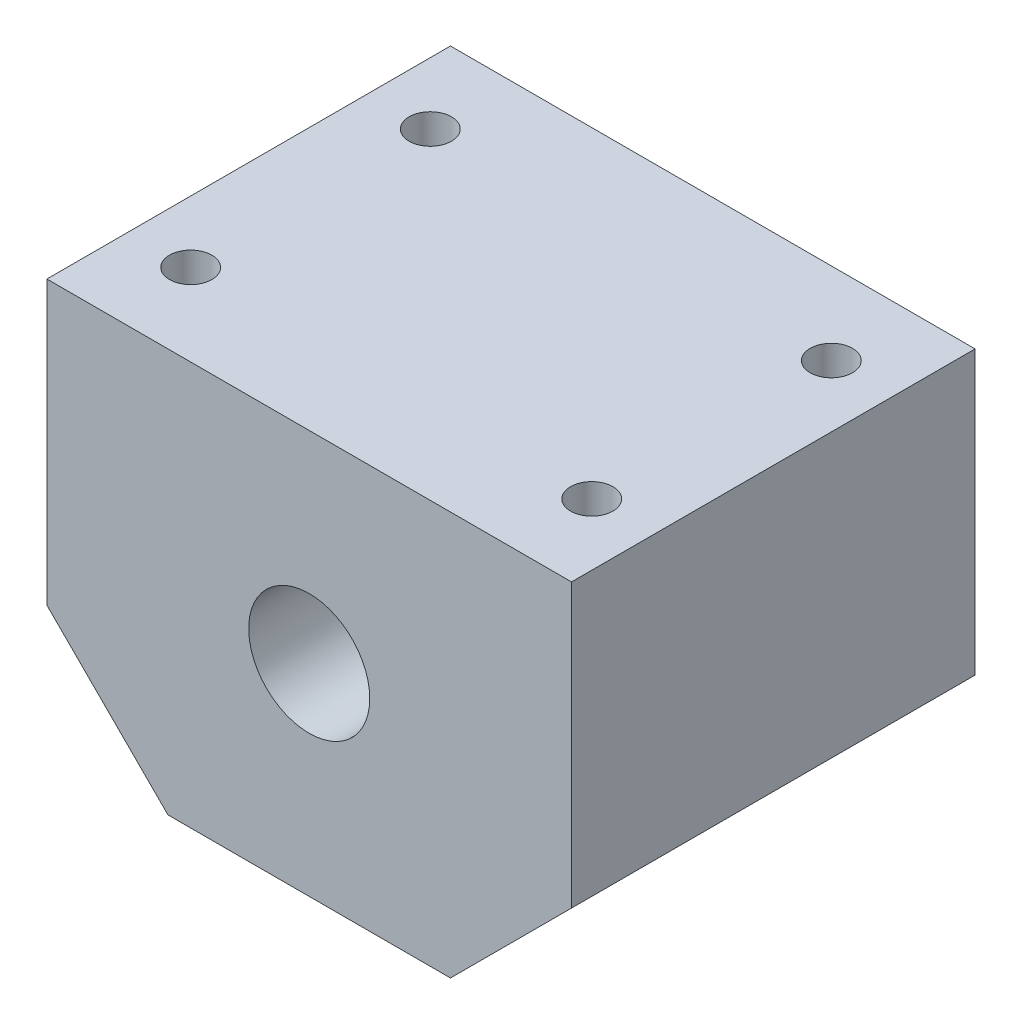
ISO-10303-21;
HEADER;
FILE_DESCRIPTION(('STEP AP214'),'2;1');
FILE_NAME('part.step','',(''),(''),'','','');
FILE_SCHEMA(('AUTOMOTIVE_DESIGN { 1 0 10303 214 1 1 1 1 }'));
ENDSEC;
DATA;
#1=APPLICATION_CONTEXT('core data for automotive mechanical design processes');
#2=APPLICATION_PROTOCOL_DEFINITION('international standard','automotive_design',2000,#1);
#3=PRODUCT_CONTEXT('',#1,'mechanical');
#4=PRODUCT('Part','Part','',(#3));
#5=PRODUCT_RELATED_PRODUCT_CATEGORY('part','',(#4));
#6=PRODUCT_DEFINITION_FORMATION('','',#4);
#7=PRODUCT_DEFINITION_CONTEXT('part definition',#1,'design');
#8=PRODUCT_DEFINITION('design','',#6,#7);
#9=PRODUCT_DEFINITION_SHAPE('','',#8);
#10=(LENGTH_UNIT() NAMED_UNIT(*) SI_UNIT(.MILLI.,.METRE.));
#11=(NAMED_UNIT(*) PLANE_ANGLE_UNIT() SI_UNIT($,.RADIAN.));
#12=(NAMED_UNIT(*) SI_UNIT($,.STERADIAN.) SOLID_ANGLE_UNIT());
#13=UNCERTAINTY_MEASURE_WITH_UNIT(LENGTH_MEASURE(1.E-05),#10,'distance_accuracy_value','');
#14=(GEOMETRIC_REPRESENTATION_CONTEXT(3) GLOBAL_UNCERTAINTY_ASSIGNED_CONTEXT((#13)) GLOBAL_UNIT_ASSIGNED_CONTEXT((#10,
#11,#12)) REPRESENTATION_CONTEXT('',''));
#15=CARTESIAN_POINT('',(0.,0.,0.));
#16=DIRECTION('',(0.,0.,1.));
#17=DIRECTION('',(1.,0.,0.));
#18=AXIS2_PLACEMENT_3D('',#15,#16,#17);
#19=CARTESIAN_POINT('',(0.,0.,20.));
#20=DIRECTION('',(0.,0.,-1.));
#21=DIRECTION('',(-1.,0.,0.));
#22=AXIS2_PLACEMENT_3D('',#19,#20,#21);
#23=PLANE('',#22);
#24=DIRECTION('',(-1.,0.,0.));
#25=VECTOR('',#24,1.);
#26=CARTESIAN_POINT('',(-26.,20.,20.));
#27=LINE('',#26,#25);
#28=CARTESIAN_POINT('',(26.,20.,20.));
#29=VERTEX_POINT('',#28);
#30=CARTESIAN_POINT('',(-26.,20.,20.));
#31=VERTEX_POINT('',#30);
#32=EDGE_CURVE('E135',#29,#31,#27,.T.);
#33=ORIENTED_EDGE('',*,*,#32,.T.);
#34=DIRECTION('',(0.,-1.,0.));
#35=VECTOR('',#34,1.);
#36=CARTESIAN_POINT('',(-26.,20.,20.));
#37=LINE('',#36,#35);
#38=CARTESIAN_POINT('',(-26.,-7.99999999999997,20.));
#39=VERTEX_POINT('',#38);
#40=EDGE_CURVE('E93',#31,#39,#37,.T.);
#41=ORIENTED_EDGE('',*,*,#40,.T.);
#42=DIRECTION('',(0.707106781186547,-0.707106781186548,0.));
#43=VECTOR('',#42,1.);
#44=CARTESIAN_POINT('',(-26.,-7.99999999999997,20.));
#45=LINE('',#44,#43);
#46=CARTESIAN_POINT('',(-14.,-20.,20.));
#47=VERTEX_POINT('',#46);
#48=EDGE_CURVE('E106',#39,#47,#45,.T.);
#49=ORIENTED_EDGE('',*,*,#48,.T.);
#50=DIRECTION('',(1.,0.,0.));
#51=VECTOR('',#50,1.);
#52=CARTESIAN_POINT('',(-14.,-20.,20.));
#53=LINE('',#52,#51);
#54=CARTESIAN_POINT('',(14.,-20.,20.));
#55=VERTEX_POINT('',#54);
#56=EDGE_CURVE('E100',#47,#55,#53,.T.);
#57=ORIENTED_EDGE('',*,*,#56,.T.);
#58=DIRECTION('',(0.707106781186547,0.707106781186548,0.));
#59=VECTOR('',#58,1.);
#60=CARTESIAN_POINT('',(26.,-7.99999999999997,20.));
#61=LINE('',#60,#59);
#62=CARTESIAN_POINT('',(26.,-7.99999999999997,20.));
#63=VERTEX_POINT('',#62);
#64=EDGE_CURVE('E104',#55,#63,#61,.T.);
#65=ORIENTED_EDGE('',*,*,#64,.T.);
#66=DIRECTION('',(0.,1.,0.));
#67=VECTOR('',#66,1.);
#68=CARTESIAN_POINT('',(26.,20.,20.));
#69=LINE('',#68,#67);
#70=EDGE_CURVE('E56',#63,#29,#69,.T.);
#71=ORIENTED_EDGE('',*,*,#70,.T.);
#72=EDGE_LOOP('',(#33,#41,#49,#57,#65,#71));
#73=FACE_BOUND('',#72,.T.);
#74=CARTESIAN_POINT('',(0.,0.,20.));
#75=DIRECTION('',(0.,0.,1.));
#76=DIRECTION('',(1.,0.,0.));
#77=AXIS2_PLACEMENT_3D('',#74,#75,#76);
#78=CIRCLE('',#77,6.);
#79=CARTESIAN_POINT('',(6.,0.,20.));
#80=VERTEX_POINT('',#79);
#81=EDGE_CURVE('E128',#80,#80,#78,.T.);
#82=ORIENTED_EDGE('',*,*,#81,.F.);
#83=EDGE_LOOP('',(#82));
#84=FACE_BOUND('',#83,.T.);
#85=ADVANCED_FACE('F39',(#73,#84),#23,.F.);
#86=CARTESIAN_POINT('',(0.,0.,-20.));
#87=DIRECTION('',(0.,0.,-1.));
#88=DIRECTION('',(-1.,0.,0.));
#89=AXIS2_PLACEMENT_3D('',#86,#87,#88);
#90=PLANE('',#89);
#91=DIRECTION('',(-1.,0.,0.));
#92=VECTOR('',#91,1.);
#93=CARTESIAN_POINT('',(-26.,20.,-20.));
#94=LINE('',#93,#92);
#95=CARTESIAN_POINT('',(26.,20.,-20.));
#96=VERTEX_POINT('',#95);
#97=CARTESIAN_POINT('',(-26.,20.,-20.));
#98=VERTEX_POINT('',#97);
#99=EDGE_CURVE('E124',#96,#98,#94,.T.);
#100=ORIENTED_EDGE('',*,*,#99,.F.);
#101=DIRECTION('',(0.,1.,0.));
#102=VECTOR('',#101,1.);
#103=CARTESIAN_POINT('',(26.,20.,-20.));
#104=LINE('',#103,#102);
#105=CARTESIAN_POINT('',(26.,-7.99999999999997,-20.));
#106=VERTEX_POINT('',#105);
#107=EDGE_CURVE('E85',#106,#96,#104,.T.);
#108=ORIENTED_EDGE('',*,*,#107,.F.);
#109=DIRECTION('',(0.707106781186547,0.707106781186548,0.));
#110=VECTOR('',#109,1.);
#111=CARTESIAN_POINT('',(26.,-7.99999999999997,-20.));
#112=LINE('',#111,#110);
#113=CARTESIAN_POINT('',(14.,-20.,-20.));
#114=VERTEX_POINT('',#113);
#115=EDGE_CURVE('E79',#114,#106,#112,.T.);
#116=ORIENTED_EDGE('',*,*,#115,.F.);
#117=DIRECTION('',(1.,0.,0.));
#118=VECTOR('',#117,1.);
#119=CARTESIAN_POINT('',(-14.,-20.,-20.));
#120=LINE('',#119,#118);
#121=CARTESIAN_POINT('',(-14.,-20.,-20.));
#122=VERTEX_POINT('',#121);
#123=EDGE_CURVE('E114',#122,#114,#120,.T.);
#124=ORIENTED_EDGE('',*,*,#123,.F.);
#125=DIRECTION('',(0.707106781186547,-0.707106781186548,0.));
#126=VECTOR('',#125,1.);
#127=CARTESIAN_POINT('',(-26.,-7.99999999999997,-20.));
#128=LINE('',#127,#126);
#129=CARTESIAN_POINT('',(-26.,-7.99999999999997,-20.));
#130=VERTEX_POINT('',#129);
#131=EDGE_CURVE('E130',#130,#122,#128,.T.);
#132=ORIENTED_EDGE('',*,*,#131,.F.);
#133=DIRECTION('',(0.,-1.,0.));
#134=VECTOR('',#133,1.);
#135=CARTESIAN_POINT('',(-26.,20.,-20.));
#136=LINE('',#135,#134);
#137=EDGE_CURVE('E127',#98,#130,#136,.T.);
#138=ORIENTED_EDGE('',*,*,#137,.F.);
#139=EDGE_LOOP('',(#100,#108,#116,#124,#132,#138));
#140=FACE_BOUND('',#139,.T.);
#141=CARTESIAN_POINT('',(0.,0.,-20.));
#142=DIRECTION('',(0.,0.,1.));
#143=DIRECTION('',(1.,0.,0.));
#144=AXIS2_PLACEMENT_3D('',#141,#142,#143);
#145=CIRCLE('',#144,6.);
#146=CARTESIAN_POINT('',(6.,0.,-20.));
#147=VERTEX_POINT('',#146);
#148=EDGE_CURVE('E228',#147,#147,#145,.T.);
#149=ORIENTED_EDGE('',*,*,#148,.T.);
#150=EDGE_LOOP('',(#149));
#151=FACE_BOUND('',#150,.T.);
#152=ADVANCED_FACE('F144',(#140,#151),#90,.T.);
#153=CARTESIAN_POINT('',(-26.,20.,20.));
#154=DIRECTION('',(0.,-1.,0.));
#155=DIRECTION('',(0.,0.,-1.));
#156=AXIS2_PLACEMENT_3D('',#153,#154,#155);
#157=PLANE('',#156);
#158=CARTESIAN_POINT('',(-19.875,20.,11.875));
#159=DIRECTION('',(0.,1.,0.));
#160=DIRECTION('',(0.,0.,1.));
#161=AXIS2_PLACEMENT_3D('',#158,#159,#160);
#162=CIRCLE('',#161,2.1);
#163=CARTESIAN_POINT('',(-19.875,20.,13.975));
#164=VERTEX_POINT('',#163);
#165=EDGE_CURVE('E221',#164,#164,#162,.T.);
#166=ORIENTED_EDGE('',*,*,#165,.F.);
#167=EDGE_LOOP('',(#166));
#168=FACE_BOUND('',#167,.T.);
#169=CARTESIAN_POINT('',(19.875,20.,11.875));
#170=DIRECTION('',(0.,1.,0.));
#171=DIRECTION('',(0.,0.,1.));
#172=AXIS2_PLACEMENT_3D('',#169,#170,#171);
#173=CIRCLE('',#172,2.1);
#174=CARTESIAN_POINT('',(19.875,20.,13.975));
#175=VERTEX_POINT('',#174);
#176=EDGE_CURVE('E213',#175,#175,#173,.T.);
#177=ORIENTED_EDGE('',*,*,#176,.F.);
#178=EDGE_LOOP('',(#177));
#179=FACE_BOUND('',#178,.T.);
#180=CARTESIAN_POINT('',(19.875,20.,-11.875));
#181=DIRECTION('',(0.,1.,0.));
#182=DIRECTION('',(0.,0.,1.));
#183=AXIS2_PLACEMENT_3D('',#180,#181,#182);
#184=CIRCLE('',#183,2.1);
#185=CARTESIAN_POINT('',(19.875,20.,-9.775));
#186=VERTEX_POINT('',#185);
#187=EDGE_CURVE('E206',#186,#186,#184,.T.);
#188=ORIENTED_EDGE('',*,*,#187,.F.);
#189=EDGE_LOOP('',(#188));
#190=FACE_BOUND('',#189,.T.);
#191=CARTESIAN_POINT('',(-19.875,20.,-11.875));
#192=DIRECTION('',(0.,1.,0.));
#193=DIRECTION('',(0.,0.,1.));
#194=AXIS2_PLACEMENT_3D('',#191,#192,#193);
#195=CIRCLE('',#194,2.1);
#196=CARTESIAN_POINT('',(-19.875,20.,-9.775));
#197=VERTEX_POINT('',#196);
#198=EDGE_CURVE('E208',#197,#197,#195,.T.);
#199=ORIENTED_EDGE('',*,*,#198,.F.);
#200=EDGE_LOOP('',(#199));
#201=FACE_BOUND('',#200,.T.);
#202=ORIENTED_EDGE('',*,*,#99,.T.);
#203=DIRECTION('',(0.,0.,-1.));
#204=VECTOR('',#203,1.);
#205=CARTESIAN_POINT('',(-26.,20.,20.));
#206=LINE('',#205,#204);
#207=EDGE_CURVE('E11',#31,#98,#206,.T.);
#208=ORIENTED_EDGE('',*,*,#207,.F.);
#209=ORIENTED_EDGE('',*,*,#32,.F.);
#210=DIRECTION('',(0.,0.,-1.));
#211=VECTOR('',#210,1.);
#212=CARTESIAN_POINT('',(26.,20.,20.));
#213=LINE('',#212,#211);
#214=EDGE_CURVE('E120',#29,#96,#213,.T.);
#215=ORIENTED_EDGE('',*,*,#214,.T.);
#216=EDGE_LOOP('',(#202,#208,#209,#215));
#217=FACE_BOUND('',#216,.T.);
#218=ADVANCED_FACE('F41',(#168,#179,#190,#201,#217),#157,.F.);
#219=CARTESIAN_POINT('',(-26.,20.,20.));
#220=DIRECTION('',(1.,0.,0.));
#221=DIRECTION('',(0.,0.,-1.));
#222=AXIS2_PLACEMENT_3D('',#219,#220,#221);
#223=PLANE('',#222);
#224=ORIENTED_EDGE('',*,*,#137,.T.);
#225=DIRECTION('',(0.,0.,-1.));
#226=VECTOR('',#225,1.);
#227=CARTESIAN_POINT('',(-26.,-7.99999999999997,20.));
#228=LINE('',#227,#226);
#229=EDGE_CURVE('E48',#39,#130,#228,.T.);
#230=ORIENTED_EDGE('',*,*,#229,.F.);
#231=ORIENTED_EDGE('',*,*,#40,.F.);
#232=ORIENTED_EDGE('',*,*,#207,.T.);
#233=EDGE_LOOP('',(#224,#230,#231,#232));
#234=FACE_BOUND('',#233,.T.);
#235=ADVANCED_FACE('F243',(#234),#223,.F.);
#236=CARTESIAN_POINT('',(-26.,-7.99999999999997,20.));
#237=DIRECTION('',(0.707106781186548,0.707106781186547,0.));
#238=DIRECTION('',(-0.707106781186547,0.707106781186548,0.));
#239=AXIS2_PLACEMENT_3D('',#236,#237,#238);
#240=PLANE('',#239);
#241=ORIENTED_EDGE('',*,*,#131,.T.);
#242=DIRECTION('',(0.,0.,-1.));
#243=VECTOR('',#242,1.);
#244=CARTESIAN_POINT('',(-14.,-20.,20.));
#245=LINE('',#244,#243);
#246=EDGE_CURVE('E115',#47,#122,#245,.T.);
#247=ORIENTED_EDGE('',*,*,#246,.F.);
#248=ORIENTED_EDGE('',*,*,#48,.F.);
#249=ORIENTED_EDGE('',*,*,#229,.T.);
#250=EDGE_LOOP('',(#241,#247,#248,#249));
#251=FACE_BOUND('',#250,.T.);
#252=ADVANCED_FACE('F141',(#251),#240,.F.);
#253=CARTESIAN_POINT('',(-14.,-20.,20.));
#254=DIRECTION('',(0.,1.,0.));
#255=DIRECTION('',(0.,0.,1.));
#256=AXIS2_PLACEMENT_3D('',#253,#254,#255);
#257=PLANE('',#256);
#258=ORIENTED_EDGE('',*,*,#123,.T.);
#259=DIRECTION('',(0.,0.,-1.));
#260=VECTOR('',#259,1.);
#261=CARTESIAN_POINT('',(14.,-20.,20.));
#262=LINE('',#261,#260);
#263=EDGE_CURVE('E111',#55,#114,#262,.T.);
#264=ORIENTED_EDGE('',*,*,#263,.F.);
#265=ORIENTED_EDGE('',*,*,#56,.F.);
#266=ORIENTED_EDGE('',*,*,#246,.T.);
#267=EDGE_LOOP('',(#258,#264,#265,#266));
#268=FACE_BOUND('',#267,.T.);
#269=ADVANCED_FACE('F112',(#268),#257,.F.);
#270=CARTESIAN_POINT('',(26.,-7.99999999999997,20.));
#271=DIRECTION('',(-0.707106781186548,0.707106781186547,0.));
#272=DIRECTION('',(-0.707106781186547,-0.707106781186548,0.));
#273=AXIS2_PLACEMENT_3D('',#270,#271,#272);
#274=PLANE('',#273);
#275=ORIENTED_EDGE('',*,*,#115,.T.);
#276=DIRECTION('',(0.,0.,-1.));
#277=VECTOR('',#276,1.);
#278=CARTESIAN_POINT('',(26.,-7.99999999999997,20.));
#279=LINE('',#278,#277);
#280=EDGE_CURVE('E116',#63,#106,#279,.T.);
#281=ORIENTED_EDGE('',*,*,#280,.F.);
#282=ORIENTED_EDGE('',*,*,#64,.F.);
#283=ORIENTED_EDGE('',*,*,#263,.T.);
#284=EDGE_LOOP('',(#275,#281,#282,#283));
#285=FACE_BOUND('',#284,.T.);
#286=ADVANCED_FACE('F118',(#285),#274,.F.);
#287=CARTESIAN_POINT('',(26.,20.,20.));
#288=DIRECTION('',(-1.,0.,0.));
#289=DIRECTION('',(0.,0.,1.));
#290=AXIS2_PLACEMENT_3D('',#287,#288,#289);
#291=PLANE('',#290);
#292=ORIENTED_EDGE('',*,*,#107,.T.);
#293=ORIENTED_EDGE('',*,*,#214,.F.);
#294=ORIENTED_EDGE('',*,*,#70,.F.);
#295=ORIENTED_EDGE('',*,*,#280,.T.);
#296=EDGE_LOOP('',(#292,#293,#294,#295));
#297=FACE_BOUND('',#296,.T.);
#298=ADVANCED_FACE('F149',(#297),#291,.F.);
#299=CARTESIAN_POINT('',(0.,0.,20.));
#300=DIRECTION('',(0.,0.,-1.));
#301=DIRECTION('',(-1.,0.,0.));
#302=AXIS2_PLACEMENT_3D('',#299,#300,#301);
#303=CYLINDRICAL_SURFACE('',#302,6.);
#304=ORIENTED_EDGE('',*,*,#81,.T.);
#305=EDGE_LOOP('',(#304));
#306=FACE_BOUND('',#305,.T.);
#307=ORIENTED_EDGE('',*,*,#148,.F.);
#308=EDGE_LOOP('',(#307));
#309=FACE_BOUND('',#308,.T.);
#310=ADVANCED_FACE('F151',(#306,#309),#303,.F.);
#311=CARTESIAN_POINT('',(-19.875,4.,-11.875));
#312=DIRECTION('',(0.,1.,0.));
#313=DIRECTION('',(0.,0.,1.));
#314=AXIS2_PLACEMENT_3D('',#311,#312,#313);
#315=CYLINDRICAL_SURFACE('',#314,2.1);
#316=CARTESIAN_POINT('',(-19.875,4.,-11.875));
#317=DIRECTION('',(0.,1.,0.));
#318=DIRECTION('',(0.,0.,1.));
#319=AXIS2_PLACEMENT_3D('',#316,#317,#318);
#320=CIRCLE('',#319,2.1);
#321=CARTESIAN_POINT('',(-19.875,4.,-9.775));
#322=VERTEX_POINT('',#321);
#323=EDGE_CURVE('E211',#322,#322,#320,.T.);
#324=ORIENTED_EDGE('',*,*,#323,.F.);
#325=EDGE_LOOP('',(#324));
#326=FACE_BOUND('',#325,.T.);
#327=ORIENTED_EDGE('',*,*,#198,.T.);
#328=EDGE_LOOP('',(#327));
#329=FACE_BOUND('',#328,.T.);
#330=ADVANCED_FACE('F157',(#326,#329),#315,.F.);
#331=CARTESIAN_POINT('',(-19.875,4.,-11.875));
#332=DIRECTION('',(0.,1.,0.));
#333=DIRECTION('',(0.,0.,1.));
#334=AXIS2_PLACEMENT_3D('',#331,#332,#333);
#335=PLANE('',#334);
#336=ORIENTED_EDGE('',*,*,#323,.T.);
#337=EDGE_LOOP('',(#336));
#338=FACE_BOUND('',#337,.T.);
#339=ADVANCED_FACE('F170',(#338),#335,.T.);
#340=CARTESIAN_POINT('',(19.875,4.,-11.875));
#341=DIRECTION('',(0.,1.,0.));
#342=DIRECTION('',(0.,0.,1.));
#343=AXIS2_PLACEMENT_3D('',#340,#341,#342);
#344=CYLINDRICAL_SURFACE('',#343,2.1);
#345=CARTESIAN_POINT('',(19.875,4.,-11.875));
#346=DIRECTION('',(0.,1.,0.));
#347=DIRECTION('',(0.,0.,1.));
#348=AXIS2_PLACEMENT_3D('',#345,#346,#347);
#349=CIRCLE('',#348,2.1);
#350=CARTESIAN_POINT('',(19.875,4.,-9.775));
#351=VERTEX_POINT('',#350);
#352=EDGE_CURVE('E203',#351,#351,#349,.T.);
#353=ORIENTED_EDGE('',*,*,#352,.F.);
#354=EDGE_LOOP('',(#353));
#355=FACE_BOUND('',#354,.T.);
#356=ORIENTED_EDGE('',*,*,#187,.T.);
#357=EDGE_LOOP('',(#356));
#358=FACE_BOUND('',#357,.T.);
#359=ADVANCED_FACE('F174',(#355,#358),#344,.F.);
#360=CARTESIAN_POINT('',(19.875,4.,-11.875));
#361=DIRECTION('',(0.,1.,0.));
#362=DIRECTION('',(0.,0.,1.));
#363=AXIS2_PLACEMENT_3D('',#360,#361,#362);
#364=PLANE('',#363);
#365=ORIENTED_EDGE('',*,*,#352,.T.);
#366=EDGE_LOOP('',(#365));
#367=FACE_BOUND('',#366,.T.);
#368=ADVANCED_FACE('F191',(#367),#364,.T.);
#369=CARTESIAN_POINT('',(19.875,4.,11.875));
#370=DIRECTION('',(0.,1.,0.));
#371=DIRECTION('',(0.,0.,1.));
#372=AXIS2_PLACEMENT_3D('',#369,#370,#371);
#373=CYLINDRICAL_SURFACE('',#372,2.1);
#374=CARTESIAN_POINT('',(19.875,4.,11.875));
#375=DIRECTION('',(0.,1.,0.));
#376=DIRECTION('',(0.,0.,1.));
#377=AXIS2_PLACEMENT_3D('',#374,#375,#376);
#378=CIRCLE('',#377,2.1);
#379=CARTESIAN_POINT('',(19.875,4.,13.975));
#380=VERTEX_POINT('',#379);
#381=EDGE_CURVE('E218',#380,#380,#378,.T.);
#382=ORIENTED_EDGE('',*,*,#381,.F.);
#383=EDGE_LOOP('',(#382));
#384=FACE_BOUND('',#383,.T.);
#385=ORIENTED_EDGE('',*,*,#176,.T.);
#386=EDGE_LOOP('',(#385));
#387=FACE_BOUND('',#386,.T.);
#388=ADVANCED_FACE('F187',(#384,#387),#373,.F.);
#389=CARTESIAN_POINT('',(19.875,4.,11.875));
#390=DIRECTION('',(0.,1.,0.));
#391=DIRECTION('',(0.,0.,1.));
#392=AXIS2_PLACEMENT_3D('',#389,#390,#391);
#393=PLANE('',#392);
#394=ORIENTED_EDGE('',*,*,#381,.T.);
#395=EDGE_LOOP('',(#394));
#396=FACE_BOUND('',#395,.T.);
#397=ADVANCED_FACE('F183',(#396),#393,.T.);
#398=CARTESIAN_POINT('',(-19.875,4.,11.875));
#399=DIRECTION('',(0.,1.,0.));
#400=DIRECTION('',(0.,0.,1.));
#401=AXIS2_PLACEMENT_3D('',#398,#399,#400);
#402=CYLINDRICAL_SURFACE('',#401,2.1);
#403=CARTESIAN_POINT('',(-19.875,4.,11.875));
#404=DIRECTION('',(0.,1.,0.));
#405=DIRECTION('',(0.,0.,1.));
#406=AXIS2_PLACEMENT_3D('',#403,#404,#405);
#407=CIRCLE('',#406,2.1);
#408=CARTESIAN_POINT('',(-19.875,4.,13.975));
#409=VERTEX_POINT('',#408);
#410=EDGE_CURVE('E224',#409,#409,#407,.T.);
#411=ORIENTED_EDGE('',*,*,#410,.F.);
#412=EDGE_LOOP('',(#411));
#413=FACE_BOUND('',#412,.T.);
#414=ORIENTED_EDGE('',*,*,#165,.T.);
#415=EDGE_LOOP('',(#414));
#416=FACE_BOUND('',#415,.T.);
#417=ADVANCED_FACE('F179',(#413,#416),#402,.F.);
#418=CARTESIAN_POINT('',(-19.875,4.,11.875));
#419=DIRECTION('',(0.,1.,0.));
#420=DIRECTION('',(0.,0.,1.));
#421=AXIS2_PLACEMENT_3D('',#418,#419,#420);
#422=PLANE('',#421);
#423=ORIENTED_EDGE('',*,*,#410,.T.);
#424=EDGE_LOOP('',(#423));
#425=FACE_BOUND('',#424,.T.);
#426=ADVANCED_FACE('F176',(#425),#422,.T.);
#427=CLOSED_SHELL('',(#85,#152,#218,#235,#252,#269,#286,#298,#310,#330,#339,#359,#368,#388,#397,
#417,#426));
#428=MANIFOLD_SOLID_BREP('B2',#427);
#429=ADVANCED_BREP_SHAPE_REPRESENTATION('',(#18,#428),#14);
#430=SHAPE_DEFINITION_REPRESENTATION(#9,#429);
ENDSEC;
END-ISO-10303-21;
